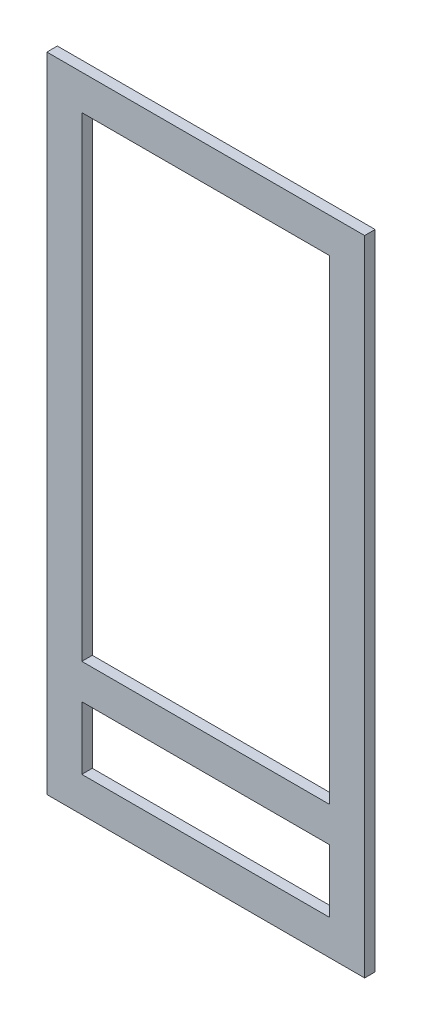
ISO-10303-21;
HEADER;
FILE_DESCRIPTION(('STEP AP214'),'2;1');
FILE_NAME('part.step','',(''),(''),'','','');
FILE_SCHEMA(('AUTOMOTIVE_DESIGN { 1 0 10303 214 1 1 1 1 }'));
ENDSEC;
DATA;
#1=APPLICATION_CONTEXT('core data for automotive mechanical design processes');
#2=APPLICATION_PROTOCOL_DEFINITION('international standard','automotive_design',2000,#1);
#3=PRODUCT_CONTEXT('',#1,'mechanical');
#4=PRODUCT('Part','Part','',(#3));
#5=PRODUCT_RELATED_PRODUCT_CATEGORY('part','',(#4));
#6=PRODUCT_DEFINITION_FORMATION('','',#4);
#7=PRODUCT_DEFINITION_CONTEXT('part definition',#1,'design');
#8=PRODUCT_DEFINITION('design','',#6,#7);
#9=PRODUCT_DEFINITION_SHAPE('','',#8);
#10=(LENGTH_UNIT() NAMED_UNIT(*) SI_UNIT(.MILLI.,.METRE.));
#11=(NAMED_UNIT(*) PLANE_ANGLE_UNIT() SI_UNIT($,.RADIAN.));
#12=(NAMED_UNIT(*) SI_UNIT($,.STERADIAN.) SOLID_ANGLE_UNIT());
#13=UNCERTAINTY_MEASURE_WITH_UNIT(LENGTH_MEASURE(1.E-05),#10,'distance_accuracy_value','');
#14=(GEOMETRIC_REPRESENTATION_CONTEXT(3) GLOBAL_UNCERTAINTY_ASSIGNED_CONTEXT((#13)) GLOBAL_UNIT_ASSIGNED_CONTEXT((#10,
#11,#12)) REPRESENTATION_CONTEXT('',''));
#15=CARTESIAN_POINT('',(0.,0.,0.));
#16=DIRECTION('',(0.,0.,1.));
#17=DIRECTION('',(1.,0.,0.));
#18=AXIS2_PLACEMENT_3D('',#15,#16,#17);
#19=CARTESIAN_POINT('',(227.35,460.,-15.));
#20=DIRECTION('',(1.,0.,0.));
#21=DIRECTION('',(0.,1.,0.));
#22=AXIS2_PLACEMENT_3D('',#19,#20,#21);
#23=PLANE('',#22);
#24=DIRECTION('',(0.,1.,0.));
#25=VECTOR('',#24,1.);
#26=CARTESIAN_POINT('',(227.35,460.,0.));
#27=LINE('',#26,#25);
#28=CARTESIAN_POINT('',(227.35,-460.,0.));
#29=VERTEX_POINT('',#28);
#30=CARTESIAN_POINT('',(227.35,460.,0.));
#31=VERTEX_POINT('',#30);
#32=EDGE_CURVE('E189',#29,#31,#27,.T.);
#33=ORIENTED_EDGE('',*,*,#32,.F.);
#34=DIRECTION('',(0.,0.,1.));
#35=VECTOR('',#34,1.);
#36=CARTESIAN_POINT('',(227.35,-460.,-15.));
#37=LINE('',#36,#35);
#38=CARTESIAN_POINT('',(227.35,-460.,-15.));
#39=VERTEX_POINT('',#38);
#40=EDGE_CURVE('E11',#39,#29,#37,.T.);
#41=ORIENTED_EDGE('',*,*,#40,.F.);
#42=DIRECTION('',(0.,1.,0.));
#43=VECTOR('',#42,1.);
#44=CARTESIAN_POINT('',(227.35,460.,-15.));
#45=LINE('',#44,#43);
#46=CARTESIAN_POINT('',(227.35,460.,-15.));
#47=VERTEX_POINT('',#46);
#48=EDGE_CURVE('E197',#39,#47,#45,.T.);
#49=ORIENTED_EDGE('',*,*,#48,.T.);
#50=DIRECTION('',(0.,0.,1.));
#51=VECTOR('',#50,1.);
#52=CARTESIAN_POINT('',(227.35,460.,-15.));
#53=LINE('',#52,#51);
#54=EDGE_CURVE('E45',#47,#31,#53,.T.);
#55=ORIENTED_EDGE('',*,*,#54,.T.);
#56=EDGE_LOOP('',(#33,#41,#49,#55));
#57=FACE_BOUND('',#56,.T.);
#58=ADVANCED_FACE('F39',(#57),#23,.T.);
#59=CARTESIAN_POINT('',(-227.35,-460.,-15.));
#60=DIRECTION('',(0.,-1.,0.));
#61=DIRECTION('',(0.,0.,-1.));
#62=AXIS2_PLACEMENT_3D('',#59,#60,#61);
#63=PLANE('',#62);
#64=DIRECTION('',(1.,0.,0.));
#65=VECTOR('',#64,1.);
#66=CARTESIAN_POINT('',(-227.35,-460.,0.));
#67=LINE('',#66,#65);
#68=CARTESIAN_POINT('',(-227.35,-460.,0.));
#69=VERTEX_POINT('',#68);
#70=EDGE_CURVE('E203',#69,#29,#67,.T.);
#71=ORIENTED_EDGE('',*,*,#70,.F.);
#72=DIRECTION('',(0.,0.,1.));
#73=VECTOR('',#72,1.);
#74=CARTESIAN_POINT('',(-227.35,-460.,-15.));
#75=LINE('',#74,#73);
#76=CARTESIAN_POINT('',(-227.35,-460.,-15.));
#77=VERTEX_POINT('',#76);
#78=EDGE_CURVE('E50',#77,#69,#75,.T.);
#79=ORIENTED_EDGE('',*,*,#78,.F.);
#80=DIRECTION('',(1.,0.,0.));
#81=VECTOR('',#80,1.);
#82=CARTESIAN_POINT('',(-227.35,-460.,-15.));
#83=LINE('',#82,#81);
#84=EDGE_CURVE('E210',#77,#39,#83,.T.);
#85=ORIENTED_EDGE('',*,*,#84,.T.);
#86=ORIENTED_EDGE('',*,*,#40,.T.);
#87=EDGE_LOOP('',(#71,#79,#85,#86));
#88=FACE_BOUND('',#87,.T.);
#89=ADVANCED_FACE('F234',(#88),#63,.T.);
#90=CARTESIAN_POINT('',(-227.35,460.,-15.));
#91=DIRECTION('',(-1.,0.,0.));
#92=DIRECTION('',(0.,-1.,0.));
#93=AXIS2_PLACEMENT_3D('',#90,#91,#92);
#94=PLANE('',#93);
#95=DIRECTION('',(0.,-1.,0.));
#96=VECTOR('',#95,1.);
#97=CARTESIAN_POINT('',(-227.35,460.,0.));
#98=LINE('',#97,#96);
#99=CARTESIAN_POINT('',(-227.35,460.,0.));
#100=VERTEX_POINT('',#99);
#101=EDGE_CURVE('E214',#100,#69,#98,.T.);
#102=ORIENTED_EDGE('',*,*,#101,.F.);
#103=DIRECTION('',(0.,0.,1.));
#104=VECTOR('',#103,1.);
#105=CARTESIAN_POINT('',(-227.35,460.,-15.));
#106=LINE('',#105,#104);
#107=CARTESIAN_POINT('',(-227.35,460.,-15.));
#108=VERTEX_POINT('',#107);
#109=EDGE_CURVE('E219',#108,#100,#106,.T.);
#110=ORIENTED_EDGE('',*,*,#109,.F.);
#111=DIRECTION('',(0.,-1.,0.));
#112=VECTOR('',#111,1.);
#113=CARTESIAN_POINT('',(-227.35,460.,-15.));
#114=LINE('',#113,#112);
#115=EDGE_CURVE('E204',#108,#77,#114,.T.);
#116=ORIENTED_EDGE('',*,*,#115,.T.);
#117=ORIENTED_EDGE('',*,*,#78,.T.);
#118=EDGE_LOOP('',(#102,#110,#116,#117));
#119=FACE_BOUND('',#118,.T.);
#120=ADVANCED_FACE('F236',(#119),#94,.T.);
#121=CARTESIAN_POINT('',(-227.35,460.,-15.));
#122=DIRECTION('',(0.,1.,0.));
#123=DIRECTION('',(0.,0.,1.));
#124=AXIS2_PLACEMENT_3D('',#121,#122,#123);
#125=PLANE('',#124);
#126=DIRECTION('',(-1.,0.,0.));
#127=VECTOR('',#126,1.);
#128=CARTESIAN_POINT('',(-227.35,460.,0.));
#129=LINE('',#128,#127);
#130=EDGE_CURVE('E215',#31,#100,#129,.T.);
#131=ORIENTED_EDGE('',*,*,#130,.F.);
#132=ORIENTED_EDGE('',*,*,#54,.F.);
#133=DIRECTION('',(-1.,0.,0.));
#134=VECTOR('',#133,1.);
#135=CARTESIAN_POINT('',(-227.35,460.,-15.));
#136=LINE('',#135,#134);
#137=EDGE_CURVE('E199',#47,#108,#136,.T.);
#138=ORIENTED_EDGE('',*,*,#137,.T.);
#139=ORIENTED_EDGE('',*,*,#109,.T.);
#140=EDGE_LOOP('',(#131,#132,#138,#139));
#141=FACE_BOUND('',#140,.T.);
#142=ADVANCED_FACE('F227',(#141),#125,.T.);
#143=CARTESIAN_POINT('',(0.,0.,-15.));
#144=DIRECTION('',(0.,0.,1.));
#145=DIRECTION('',(1.,0.,0.));
#146=AXIS2_PLACEMENT_3D('',#143,#144,#145);
#147=PLANE('',#146);
#148=DIRECTION('',(-1.,0.,0.));
#149=VECTOR('',#148,1.);
#150=CARTESIAN_POINT('',(-177.35,-320.,-15.));
#151=LINE('',#150,#149);
#152=CARTESIAN_POINT('',(177.35,-320.,-15.));
#153=VERTEX_POINT('',#152);
#154=CARTESIAN_POINT('',(-177.35,-320.,-15.));
#155=VERTEX_POINT('',#154);
#156=EDGE_CURVE('E136',#153,#155,#151,.T.);
#157=ORIENTED_EDGE('',*,*,#156,.T.);
#158=DIRECTION('',(0.,-1.,0.));
#159=VECTOR('',#158,1.);
#160=CARTESIAN_POINT('',(-177.35,-320.,-15.));
#161=LINE('',#160,#159);
#162=CARTESIAN_POINT('',(-177.35,-410.,-15.));
#163=VERTEX_POINT('',#162);
#164=EDGE_CURVE('E128',#155,#163,#161,.T.);
#165=ORIENTED_EDGE('',*,*,#164,.T.);
#166=DIRECTION('',(1.,0.,0.));
#167=VECTOR('',#166,1.);
#168=CARTESIAN_POINT('',(-177.35,-410.,-15.));
#169=LINE('',#168,#167);
#170=CARTESIAN_POINT('',(177.35,-410.,-15.));
#171=VERTEX_POINT('',#170);
#172=EDGE_CURVE('E138',#163,#171,#169,.T.);
#173=ORIENTED_EDGE('',*,*,#172,.T.);
#174=DIRECTION('',(0.,1.,0.));
#175=VECTOR('',#174,1.);
#176=CARTESIAN_POINT('',(177.35,-320.,-15.));
#177=LINE('',#176,#175);
#178=EDGE_CURVE('E54',#171,#153,#177,.T.);
#179=ORIENTED_EDGE('',*,*,#178,.T.);
#180=EDGE_LOOP('',(#157,#165,#173,#179));
#181=FACE_BOUND('',#180,.T.);
#182=DIRECTION('',(-1.,0.,0.));
#183=VECTOR('',#182,1.);
#184=CARTESIAN_POINT('',(-177.35,410.,-15.));
#185=LINE('',#184,#183);
#186=CARTESIAN_POINT('',(177.35,410.,-15.));
#187=VERTEX_POINT('',#186);
#188=CARTESIAN_POINT('',(-177.35,410.,-15.));
#189=VERTEX_POINT('',#188);
#190=EDGE_CURVE('E174',#187,#189,#185,.T.);
#191=ORIENTED_EDGE('',*,*,#190,.T.);
#192=DIRECTION('',(0.,-1.,0.));
#193=VECTOR('',#192,1.);
#194=CARTESIAN_POINT('',(-177.35,410.,-15.));
#195=LINE('',#194,#193);
#196=CARTESIAN_POINT('',(-177.35,-270.,-15.));
#197=VERTEX_POINT('',#196);
#198=EDGE_CURVE('E164',#189,#197,#195,.T.);
#199=ORIENTED_EDGE('',*,*,#198,.T.);
#200=DIRECTION('',(1.,0.,0.));
#201=VECTOR('',#200,1.);
#202=CARTESIAN_POINT('',(-177.35,-270.,-15.));
#203=LINE('',#202,#201);
#204=CARTESIAN_POINT('',(177.35,-270.,-15.));
#205=VERTEX_POINT('',#204);
#206=EDGE_CURVE('E169',#197,#205,#203,.T.);
#207=ORIENTED_EDGE('',*,*,#206,.T.);
#208=DIRECTION('',(0.,1.,0.));
#209=VECTOR('',#208,1.);
#210=CARTESIAN_POINT('',(177.35,410.,-15.));
#211=LINE('',#210,#209);
#212=EDGE_CURVE('E175',#205,#187,#211,.T.);
#213=ORIENTED_EDGE('',*,*,#212,.T.);
#214=EDGE_LOOP('',(#191,#199,#207,#213));
#215=FACE_BOUND('',#214,.T.);
#216=ORIENTED_EDGE('',*,*,#48,.F.);
#217=ORIENTED_EDGE('',*,*,#84,.F.);
#218=ORIENTED_EDGE('',*,*,#115,.F.);
#219=ORIENTED_EDGE('',*,*,#137,.F.);
#220=EDGE_LOOP('',(#216,#217,#218,#219));
#221=FACE_BOUND('',#220,.T.);
#222=ADVANCED_FACE('F141',(#181,#215,#221),#147,.F.);
#223=CARTESIAN_POINT('',(0.,0.,0.));
#224=DIRECTION('',(0.,0.,1.));
#225=DIRECTION('',(1.,0.,0.));
#226=AXIS2_PLACEMENT_3D('',#223,#224,#225);
#227=PLANE('',#226);
#228=DIRECTION('',(0.,-1.,0.));
#229=VECTOR('',#228,1.);
#230=CARTESIAN_POINT('',(-177.35,-320.,0.));
#231=LINE('',#230,#229);
#232=CARTESIAN_POINT('',(-177.35,-320.,0.));
#233=VERTEX_POINT('',#232);
#234=CARTESIAN_POINT('',(-177.35,-410.,0.));
#235=VERTEX_POINT('',#234);
#236=EDGE_CURVE('E62',#233,#235,#231,.T.);
#237=ORIENTED_EDGE('',*,*,#236,.F.);
#238=DIRECTION('',(-1.,0.,0.));
#239=VECTOR('',#238,1.);
#240=CARTESIAN_POINT('',(-177.35,-320.,0.));
#241=LINE('',#240,#239);
#242=CARTESIAN_POINT('',(177.35,-320.,0.));
#243=VERTEX_POINT('',#242);
#244=EDGE_CURVE('E148',#243,#233,#241,.T.);
#245=ORIENTED_EDGE('',*,*,#244,.F.);
#246=DIRECTION('',(0.,1.,0.));
#247=VECTOR('',#246,1.);
#248=CARTESIAN_POINT('',(177.35,-320.,0.));
#249=LINE('',#248,#247);
#250=CARTESIAN_POINT('',(177.35,-410.,0.));
#251=VERTEX_POINT('',#250);
#252=EDGE_CURVE('E149',#251,#243,#249,.T.);
#253=ORIENTED_EDGE('',*,*,#252,.F.);
#254=DIRECTION('',(1.,0.,0.));
#255=VECTOR('',#254,1.);
#256=CARTESIAN_POINT('',(-177.35,-410.,0.));
#257=LINE('',#256,#255);
#258=EDGE_CURVE('E154',#235,#251,#257,.T.);
#259=ORIENTED_EDGE('',*,*,#258,.F.);
#260=EDGE_LOOP('',(#237,#245,#253,#259));
#261=FACE_BOUND('',#260,.T.);
#262=DIRECTION('',(0.,-1.,0.));
#263=VECTOR('',#262,1.);
#264=CARTESIAN_POINT('',(-177.35,410.,0.));
#265=LINE('',#264,#263);
#266=CARTESIAN_POINT('',(-177.35,410.,0.));
#267=VERTEX_POINT('',#266);
#268=CARTESIAN_POINT('',(-177.35,-270.,0.));
#269=VERTEX_POINT('',#268);
#270=EDGE_CURVE('E161',#267,#269,#265,.T.);
#271=ORIENTED_EDGE('',*,*,#270,.F.);
#272=DIRECTION('',(-1.,0.,0.));
#273=VECTOR('',#272,1.);
#274=CARTESIAN_POINT('',(-177.35,410.,0.));
#275=LINE('',#274,#273);
#276=CARTESIAN_POINT('',(177.35,410.,0.));
#277=VERTEX_POINT('',#276);
#278=EDGE_CURVE('E166',#277,#267,#275,.T.);
#279=ORIENTED_EDGE('',*,*,#278,.F.);
#280=DIRECTION('',(0.,1.,0.));
#281=VECTOR('',#280,1.);
#282=CARTESIAN_POINT('',(177.35,410.,0.));
#283=LINE('',#282,#281);
#284=CARTESIAN_POINT('',(177.35,-270.,0.));
#285=VERTEX_POINT('',#284);
#286=EDGE_CURVE('E181',#285,#277,#283,.T.);
#287=ORIENTED_EDGE('',*,*,#286,.F.);
#288=DIRECTION('',(1.,0.,0.));
#289=VECTOR('',#288,1.);
#290=CARTESIAN_POINT('',(-177.35,-270.,0.));
#291=LINE('',#290,#289);
#292=EDGE_CURVE('E180',#269,#285,#291,.T.);
#293=ORIENTED_EDGE('',*,*,#292,.F.);
#294=EDGE_LOOP('',(#271,#279,#287,#293));
#295=FACE_BOUND('',#294,.T.);
#296=ORIENTED_EDGE('',*,*,#32,.T.);
#297=ORIENTED_EDGE('',*,*,#130,.T.);
#298=ORIENTED_EDGE('',*,*,#101,.T.);
#299=ORIENTED_EDGE('',*,*,#70,.T.);
#300=EDGE_LOOP('',(#296,#297,#298,#299));
#301=FACE_BOUND('',#300,.T.);
#302=ADVANCED_FACE('F229',(#261,#295,#301),#227,.T.);
#303=CARTESIAN_POINT('',(-177.35,410.,-15.));
#304=DIRECTION('',(-1.,0.,0.));
#305=DIRECTION('',(0.,-1.,0.));
#306=AXIS2_PLACEMENT_3D('',#303,#304,#305);
#307=PLANE('',#306);
#308=ORIENTED_EDGE('',*,*,#270,.T.);
#309=DIRECTION('',(0.,0.,1.));
#310=VECTOR('',#309,1.);
#311=CARTESIAN_POINT('',(-177.35,-270.,-15.));
#312=LINE('',#311,#310);
#313=EDGE_CURVE('E179',#197,#269,#312,.T.);
#314=ORIENTED_EDGE('',*,*,#313,.F.);
#315=ORIENTED_EDGE('',*,*,#198,.F.);
#316=DIRECTION('',(0.,0.,1.));
#317=VECTOR('',#316,1.);
#318=CARTESIAN_POINT('',(-177.35,410.,-15.));
#319=LINE('',#318,#317);
#320=EDGE_CURVE('E187',#189,#267,#319,.T.);
#321=ORIENTED_EDGE('',*,*,#320,.T.);
#322=EDGE_LOOP('',(#308,#314,#315,#321));
#323=FACE_BOUND('',#322,.T.);
#324=ADVANCED_FACE('F283',(#323),#307,.F.);
#325=CARTESIAN_POINT('',(-177.35,410.,-15.));
#326=DIRECTION('',(0.,1.,0.));
#327=DIRECTION('',(0.,0.,1.));
#328=AXIS2_PLACEMENT_3D('',#325,#326,#327);
#329=PLANE('',#328);
#330=ORIENTED_EDGE('',*,*,#278,.T.);
#331=ORIENTED_EDGE('',*,*,#320,.F.);
#332=ORIENTED_EDGE('',*,*,#190,.F.);
#333=DIRECTION('',(0.,0.,1.));
#334=VECTOR('',#333,1.);
#335=CARTESIAN_POINT('',(177.35,410.,-15.));
#336=LINE('',#335,#334);
#337=EDGE_CURVE('E191',#187,#277,#336,.T.);
#338=ORIENTED_EDGE('',*,*,#337,.T.);
#339=EDGE_LOOP('',(#330,#331,#332,#338));
#340=FACE_BOUND('',#339,.T.);
#341=ADVANCED_FACE('F294',(#340),#329,.F.);
#342=CARTESIAN_POINT('',(177.35,410.,-15.));
#343=DIRECTION('',(1.,0.,0.));
#344=DIRECTION('',(0.,1.,0.));
#345=AXIS2_PLACEMENT_3D('',#342,#343,#344);
#346=PLANE('',#345);
#347=ORIENTED_EDGE('',*,*,#286,.T.);
#348=ORIENTED_EDGE('',*,*,#337,.F.);
#349=ORIENTED_EDGE('',*,*,#212,.F.);
#350=DIRECTION('',(0.,0.,1.));
#351=VECTOR('',#350,1.);
#352=CARTESIAN_POINT('',(177.35,-270.,-15.));
#353=LINE('',#352,#351);
#354=EDGE_CURVE('E194',#205,#285,#353,.T.);
#355=ORIENTED_EDGE('',*,*,#354,.T.);
#356=EDGE_LOOP('',(#347,#348,#349,#355));
#357=FACE_BOUND('',#356,.T.);
#358=ADVANCED_FACE('F303',(#357),#346,.F.);
#359=CARTESIAN_POINT('',(-177.35,-270.,-15.));
#360=DIRECTION('',(0.,-1.,0.));
#361=DIRECTION('',(0.,0.,-1.));
#362=AXIS2_PLACEMENT_3D('',#359,#360,#361);
#363=PLANE('',#362);
#364=ORIENTED_EDGE('',*,*,#292,.T.);
#365=ORIENTED_EDGE('',*,*,#354,.F.);
#366=ORIENTED_EDGE('',*,*,#206,.F.);
#367=ORIENTED_EDGE('',*,*,#313,.T.);
#368=EDGE_LOOP('',(#364,#365,#366,#367));
#369=FACE_BOUND('',#368,.T.);
#370=ADVANCED_FACE('F314',(#369),#363,.F.);
#371=CARTESIAN_POINT('',(-177.35,-320.,-15.));
#372=DIRECTION('',(-1.,0.,0.));
#373=DIRECTION('',(0.,0.,1.));
#374=AXIS2_PLACEMENT_3D('',#371,#372,#373);
#375=PLANE('',#374);
#376=ORIENTED_EDGE('',*,*,#236,.T.);
#377=DIRECTION('',(0.,0.,1.));
#378=VECTOR('',#377,1.);
#379=CARTESIAN_POINT('',(-177.35,-410.,-15.));
#380=LINE('',#379,#378);
#381=EDGE_CURVE('E127',#163,#235,#380,.T.);
#382=ORIENTED_EDGE('',*,*,#381,.F.);
#383=ORIENTED_EDGE('',*,*,#164,.F.);
#384=DIRECTION('',(0.,0.,1.));
#385=VECTOR('',#384,1.);
#386=CARTESIAN_POINT('',(-177.35,-320.,-15.));
#387=LINE('',#386,#385);
#388=EDGE_CURVE('E157',#155,#233,#387,.T.);
#389=ORIENTED_EDGE('',*,*,#388,.T.);
#390=EDGE_LOOP('',(#376,#382,#383,#389));
#391=FACE_BOUND('',#390,.T.);
#392=ADVANCED_FACE('F126',(#391),#375,.F.);
#393=CARTESIAN_POINT('',(-177.35,-320.,-15.));
#394=DIRECTION('',(0.,1.,0.));
#395=DIRECTION('',(0.,0.,1.));
#396=AXIS2_PLACEMENT_3D('',#393,#394,#395);
#397=PLANE('',#396);
#398=ORIENTED_EDGE('',*,*,#244,.T.);
#399=ORIENTED_EDGE('',*,*,#388,.F.);
#400=ORIENTED_EDGE('',*,*,#156,.F.);
#401=DIRECTION('',(0.,0.,1.));
#402=VECTOR('',#401,1.);
#403=CARTESIAN_POINT('',(177.35,-320.,-15.));
#404=LINE('',#403,#402);
#405=EDGE_CURVE('E165',#153,#243,#404,.T.);
#406=ORIENTED_EDGE('',*,*,#405,.T.);
#407=EDGE_LOOP('',(#398,#399,#400,#406));
#408=FACE_BOUND('',#407,.T.);
#409=ADVANCED_FACE('F332',(#408),#397,.F.);
#410=CARTESIAN_POINT('',(177.35,-320.,-15.));
#411=DIRECTION('',(1.,0.,0.));
#412=DIRECTION('',(0.,0.,-1.));
#413=AXIS2_PLACEMENT_3D('',#410,#411,#412);
#414=PLANE('',#413);
#415=ORIENTED_EDGE('',*,*,#252,.T.);
#416=ORIENTED_EDGE('',*,*,#405,.F.);
#417=ORIENTED_EDGE('',*,*,#178,.F.);
#418=DIRECTION('',(0.,0.,1.));
#419=VECTOR('',#418,1.);
#420=CARTESIAN_POINT('',(177.35,-410.,-15.));
#421=LINE('',#420,#419);
#422=EDGE_CURVE('E134',#171,#251,#421,.T.);
#423=ORIENTED_EDGE('',*,*,#422,.T.);
#424=EDGE_LOOP('',(#415,#416,#417,#423));
#425=FACE_BOUND('',#424,.T.);
#426=ADVANCED_FACE('F339',(#425),#414,.F.);
#427=CARTESIAN_POINT('',(-177.35,-410.,-15.));
#428=DIRECTION('',(0.,-1.,0.));
#429=DIRECTION('',(0.,0.,-1.));
#430=AXIS2_PLACEMENT_3D('',#427,#428,#429);
#431=PLANE('',#430);
#432=ORIENTED_EDGE('',*,*,#258,.T.);
#433=ORIENTED_EDGE('',*,*,#422,.F.);
#434=ORIENTED_EDGE('',*,*,#172,.F.);
#435=ORIENTED_EDGE('',*,*,#381,.T.);
#436=EDGE_LOOP('',(#432,#433,#434,#435));
#437=FACE_BOUND('',#436,.T.);
#438=ADVANCED_FACE('F140',(#437),#431,.F.);
#439=CLOSED_SHELL('',(#58,#89,#120,#142,#222,#302,#324,#341,#358,#370,#392,#409,#426,#438));
#440=MANIFOLD_SOLID_BREP('B2',#439);
#441=ADVANCED_BREP_SHAPE_REPRESENTATION('',(#18,#440),#14);
#442=SHAPE_DEFINITION_REPRESENTATION(#9,#441);
ENDSEC;
END-ISO-10303-21;
